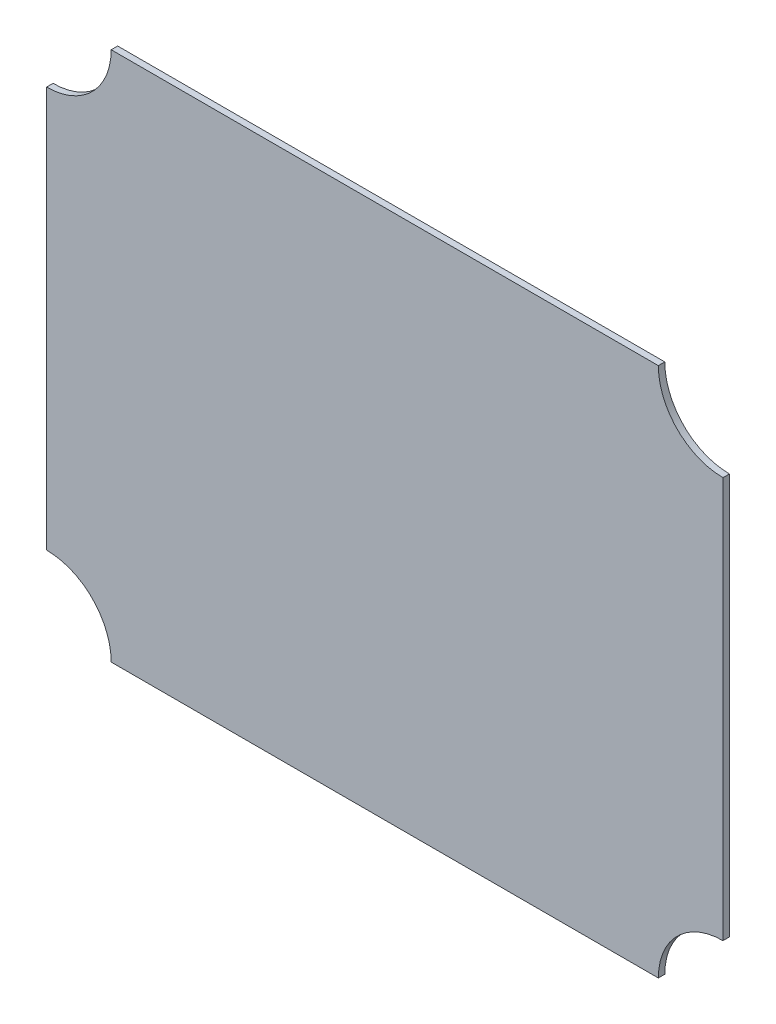
ISO-10303-21;
HEADER;
FILE_DESCRIPTION(('STEP AP214'),'2;1');
FILE_NAME('part.step','',(''),(''),'','','');
FILE_SCHEMA(('AUTOMOTIVE_DESIGN { 1 0 10303 214 1 1 1 1 }'));
ENDSEC;
DATA;
#1=APPLICATION_CONTEXT('core data for automotive mechanical design processes');
#2=APPLICATION_PROTOCOL_DEFINITION('international standard','automotive_design',2000,#1);
#3=PRODUCT_CONTEXT('',#1,'mechanical');
#4=PRODUCT('Part','Part','',(#3));
#5=PRODUCT_RELATED_PRODUCT_CATEGORY('part','',(#4));
#6=PRODUCT_DEFINITION_FORMATION('','',#4);
#7=PRODUCT_DEFINITION_CONTEXT('part definition',#1,'design');
#8=PRODUCT_DEFINITION('design','',#6,#7);
#9=PRODUCT_DEFINITION_SHAPE('','',#8);
#10=(LENGTH_UNIT() NAMED_UNIT(*) SI_UNIT(.MILLI.,.METRE.));
#11=(NAMED_UNIT(*) PLANE_ANGLE_UNIT() SI_UNIT($,.RADIAN.));
#12=(NAMED_UNIT(*) SI_UNIT($,.STERADIAN.) SOLID_ANGLE_UNIT());
#13=UNCERTAINTY_MEASURE_WITH_UNIT(LENGTH_MEASURE(1.E-05),#10,'distance_accuracy_value','');
#14=(GEOMETRIC_REPRESENTATION_CONTEXT(3) GLOBAL_UNCERTAINTY_ASSIGNED_CONTEXT((#13)) GLOBAL_UNIT_ASSIGNED_CONTEXT((#10,
#11,#12)) REPRESENTATION_CONTEXT('',''));
#15=CARTESIAN_POINT('',(0.,0.,0.));
#16=DIRECTION('',(0.,0.,1.));
#17=DIRECTION('',(1.,0.,0.));
#18=AXIS2_PLACEMENT_3D('',#15,#16,#17);
#19=CARTESIAN_POINT('',(261.5,205.,2.5));
#20=DIRECTION('',(0.,0.,-1.));
#21=DIRECTION('',(-1.,0.,0.));
#22=AXIS2_PLACEMENT_3D('',#19,#20,#21);
#23=CYLINDRICAL_SURFACE('',#22,50.);
#24=CARTESIAN_POINT('',(261.5,205.,-2.5));
#25=DIRECTION('',(0.,0.,-1.));
#26=DIRECTION('',(-1.,0.,0.));
#27=AXIS2_PLACEMENT_3D('',#24,#25,#26);
#28=CIRCLE('',#27,50.);
#29=CARTESIAN_POINT('',(261.5,155.,-2.5));
#30=VERTEX_POINT('',#29);
#31=CARTESIAN_POINT('',(211.5,205.,-2.5));
#32=VERTEX_POINT('',#31);
#33=EDGE_CURVE('E137',#30,#32,#28,.T.);
#34=ORIENTED_EDGE('',*,*,#33,.T.);
#35=DIRECTION('',(0.,0.,-1.));
#36=VECTOR('',#35,1.);
#37=CARTESIAN_POINT('',(211.5,205.,2.5));
#38=LINE('',#37,#36);
#39=CARTESIAN_POINT('',(211.5,205.,2.5));
#40=VERTEX_POINT('',#39);
#41=EDGE_CURVE('E12',#40,#32,#38,.T.);
#42=ORIENTED_EDGE('',*,*,#41,.F.);
#43=CARTESIAN_POINT('',(261.5,205.,2.5));
#44=DIRECTION('',(0.,0.,-1.));
#45=DIRECTION('',(-1.,0.,0.));
#46=AXIS2_PLACEMENT_3D('',#43,#44,#45);
#47=CIRCLE('',#46,50.);
#48=CARTESIAN_POINT('',(261.5,155.,2.5));
#49=VERTEX_POINT('',#48);
#50=EDGE_CURVE('E153',#49,#40,#47,.T.);
#51=ORIENTED_EDGE('',*,*,#50,.F.);
#52=DIRECTION('',(0.,0.,-1.));
#53=VECTOR('',#52,1.);
#54=CARTESIAN_POINT('',(261.5,155.,2.5));
#55=LINE('',#54,#53);
#56=EDGE_CURVE('E133',#49,#30,#55,.T.);
#57=ORIENTED_EDGE('',*,*,#56,.T.);
#58=EDGE_LOOP('',(#34,#42,#51,#57));
#59=FACE_BOUND('',#58,.T.);
#60=ADVANCED_FACE('F41',(#59),#23,.F.);
#61=CARTESIAN_POINT('',(-211.5,205.,2.5));
#62=DIRECTION('',(0.,-1.,0.));
#63=DIRECTION('',(1.,0.,0.));
#64=AXIS2_PLACEMENT_3D('',#61,#62,#63);
#65=PLANE('',#64);
#66=DIRECTION('',(-1.,0.,0.));
#67=VECTOR('',#66,1.);
#68=CARTESIAN_POINT('',(-211.5,205.,-2.5));
#69=LINE('',#68,#67);
#70=CARTESIAN_POINT('',(-211.5,205.,-2.5));
#71=VERTEX_POINT('',#70);
#72=EDGE_CURVE('E141',#32,#71,#69,.T.);
#73=ORIENTED_EDGE('',*,*,#72,.T.);
#74=DIRECTION('',(0.,0.,-1.));
#75=VECTOR('',#74,1.);
#76=CARTESIAN_POINT('',(-211.5,205.,2.5));
#77=LINE('',#76,#75);
#78=CARTESIAN_POINT('',(-211.5,205.,2.5));
#79=VERTEX_POINT('',#78);
#80=EDGE_CURVE('E49',#79,#71,#77,.T.);
#81=ORIENTED_EDGE('',*,*,#80,.F.);
#82=DIRECTION('',(-1.,0.,0.));
#83=VECTOR('',#82,1.);
#84=CARTESIAN_POINT('',(-211.5,205.,2.5));
#85=LINE('',#84,#83);
#86=EDGE_CURVE('E100',#40,#79,#85,.T.);
#87=ORIENTED_EDGE('',*,*,#86,.F.);
#88=ORIENTED_EDGE('',*,*,#41,.T.);
#89=EDGE_LOOP('',(#73,#81,#87,#88));
#90=FACE_BOUND('',#89,.T.);
#91=ADVANCED_FACE('F210',(#90),#65,.F.);
#92=CARTESIAN_POINT('',(-261.5,205.,2.5));
#93=DIRECTION('',(0.,0.,-1.));
#94=DIRECTION('',(-1.,0.,0.));
#95=AXIS2_PLACEMENT_3D('',#92,#93,#94);
#96=CYLINDRICAL_SURFACE('',#95,50.);
#97=CARTESIAN_POINT('',(-261.5,205.,-2.5));
#98=DIRECTION('',(0.,0.,-1.));
#99=DIRECTION('',(1.,0.,0.));
#100=AXIS2_PLACEMENT_3D('',#97,#98,#99);
#101=CIRCLE('',#100,50.);
#102=CARTESIAN_POINT('',(-261.5,155.,-2.5));
#103=VERTEX_POINT('',#102);
#104=EDGE_CURVE('E170',#71,#103,#101,.T.);
#105=ORIENTED_EDGE('',*,*,#104,.T.);
#106=DIRECTION('',(0.,0.,-1.));
#107=VECTOR('',#106,1.);
#108=CARTESIAN_POINT('',(-261.5,155.,2.5));
#109=LINE('',#108,#107);
#110=CARTESIAN_POINT('',(-261.5,155.,2.5));
#111=VERTEX_POINT('',#110);
#112=EDGE_CURVE('E162',#111,#103,#109,.T.);
#113=ORIENTED_EDGE('',*,*,#112,.F.);
#114=CARTESIAN_POINT('',(-261.5,205.,2.5));
#115=DIRECTION('',(0.,0.,-1.));
#116=DIRECTION('',(1.,0.,0.));
#117=AXIS2_PLACEMENT_3D('',#114,#115,#116);
#118=CIRCLE('',#117,50.);
#119=EDGE_CURVE('E171',#79,#111,#118,.T.);
#120=ORIENTED_EDGE('',*,*,#119,.F.);
#121=ORIENTED_EDGE('',*,*,#80,.T.);
#122=EDGE_LOOP('',(#105,#113,#120,#121));
#123=FACE_BOUND('',#122,.T.);
#124=ADVANCED_FACE('F168',(#123),#96,.F.);
#125=CARTESIAN_POINT('',(-261.5,155.,2.5));
#126=DIRECTION('',(1.,0.,0.));
#127=DIRECTION('',(0.,1.,0.));
#128=AXIS2_PLACEMENT_3D('',#125,#126,#127);
#129=PLANE('',#128);
#130=DIRECTION('',(0.,-1.,0.));
#131=VECTOR('',#130,1.);
#132=CARTESIAN_POINT('',(-261.5,155.,-2.5));
#133=LINE('',#132,#131);
#134=CARTESIAN_POINT('',(-261.5,-155.,-2.5));
#135=VERTEX_POINT('',#134);
#136=EDGE_CURVE('E177',#103,#135,#133,.T.);
#137=ORIENTED_EDGE('',*,*,#136,.T.);
#138=DIRECTION('',(0.,0.,-1.));
#139=VECTOR('',#138,1.);
#140=CARTESIAN_POINT('',(-261.5,-155.,2.5));
#141=LINE('',#140,#139);
#142=CARTESIAN_POINT('',(-261.5,-155.,2.5));
#143=VERTEX_POINT('',#142);
#144=EDGE_CURVE('E159',#143,#135,#141,.T.);
#145=ORIENTED_EDGE('',*,*,#144,.F.);
#146=DIRECTION('',(0.,-1.,0.));
#147=VECTOR('',#146,1.);
#148=CARTESIAN_POINT('',(-261.5,155.,2.5));
#149=LINE('',#148,#147);
#150=EDGE_CURVE('E302',#111,#143,#149,.T.);
#151=ORIENTED_EDGE('',*,*,#150,.F.);
#152=ORIENTED_EDGE('',*,*,#112,.T.);
#153=EDGE_LOOP('',(#137,#145,#151,#152));
#154=FACE_BOUND('',#153,.T.);
#155=ADVANCED_FACE('F217',(#154),#129,.F.);
#156=CARTESIAN_POINT('',(-261.5,-205.,2.5));
#157=DIRECTION('',(0.,0.,-1.));
#158=DIRECTION('',(-1.,0.,0.));
#159=AXIS2_PLACEMENT_3D('',#156,#157,#158);
#160=CYLINDRICAL_SURFACE('',#159,50.);
#161=CARTESIAN_POINT('',(-261.5,-205.,-2.5));
#162=DIRECTION('',(0.,0.,-1.));
#163=DIRECTION('',(-1.,0.,0.));
#164=AXIS2_PLACEMENT_3D('',#161,#162,#163);
#165=CIRCLE('',#164,50.);
#166=CARTESIAN_POINT('',(-211.5,-205.,-2.5));
#167=VERTEX_POINT('',#166);
#168=EDGE_CURVE('E181',#135,#167,#165,.T.);
#169=ORIENTED_EDGE('',*,*,#168,.T.);
#170=DIRECTION('',(0.,0.,-1.));
#171=VECTOR('',#170,1.);
#172=CARTESIAN_POINT('',(-211.5,-205.,2.5));
#173=LINE('',#172,#171);
#174=CARTESIAN_POINT('',(-211.5,-205.,2.5));
#175=VERTEX_POINT('',#174);
#176=EDGE_CURVE('E128',#175,#167,#173,.T.);
#177=ORIENTED_EDGE('',*,*,#176,.F.);
#178=CARTESIAN_POINT('',(-261.5,-205.,2.5));
#179=DIRECTION('',(0.,0.,-1.));
#180=DIRECTION('',(-1.,0.,0.));
#181=AXIS2_PLACEMENT_3D('',#178,#179,#180);
#182=CIRCLE('',#181,50.);
#183=EDGE_CURVE('E119',#143,#175,#182,.T.);
#184=ORIENTED_EDGE('',*,*,#183,.F.);
#185=ORIENTED_EDGE('',*,*,#144,.T.);
#186=EDGE_LOOP('',(#169,#177,#184,#185));
#187=FACE_BOUND('',#186,.T.);
#188=ADVANCED_FACE('F194',(#187),#160,.F.);
#189=CARTESIAN_POINT('',(-211.5,-205.,2.5));
#190=DIRECTION('',(0.,1.,0.));
#191=DIRECTION('',(-1.,0.,0.));
#192=AXIS2_PLACEMENT_3D('',#189,#190,#191);
#193=PLANE('',#192);
#194=DIRECTION('',(1.,0.,0.));
#195=VECTOR('',#194,1.);
#196=CARTESIAN_POINT('',(-211.5,-205.,-2.5));
#197=LINE('',#196,#195);
#198=CARTESIAN_POINT('',(211.5,-205.,-2.5));
#199=VERTEX_POINT('',#198);
#200=EDGE_CURVE('E127',#167,#199,#197,.T.);
#201=ORIENTED_EDGE('',*,*,#200,.T.);
#202=DIRECTION('',(0.,0.,-1.));
#203=VECTOR('',#202,1.);
#204=CARTESIAN_POINT('',(211.5,-205.,2.5));
#205=LINE('',#204,#203);
#206=CARTESIAN_POINT('',(211.5,-205.,2.5));
#207=VERTEX_POINT('',#206);
#208=EDGE_CURVE('E124',#207,#199,#205,.T.);
#209=ORIENTED_EDGE('',*,*,#208,.F.);
#210=DIRECTION('',(1.,0.,0.));
#211=VECTOR('',#210,1.);
#212=CARTESIAN_POINT('',(-211.5,-205.,2.5));
#213=LINE('',#212,#211);
#214=EDGE_CURVE('E113',#175,#207,#213,.T.);
#215=ORIENTED_EDGE('',*,*,#214,.F.);
#216=ORIENTED_EDGE('',*,*,#176,.T.);
#217=EDGE_LOOP('',(#201,#209,#215,#216));
#218=FACE_BOUND('',#217,.T.);
#219=ADVANCED_FACE('F125',(#218),#193,.F.);
#220=CARTESIAN_POINT('',(261.5,-205.,2.5));
#221=DIRECTION('',(0.,0.,-1.));
#222=DIRECTION('',(-1.,0.,0.));
#223=AXIS2_PLACEMENT_3D('',#220,#221,#222);
#224=CYLINDRICAL_SURFACE('',#223,50.);
#225=CARTESIAN_POINT('',(261.5,-205.,-2.5));
#226=DIRECTION('',(0.,0.,-1.));
#227=DIRECTION('',(1.,0.,0.));
#228=AXIS2_PLACEMENT_3D('',#225,#226,#227);
#229=CIRCLE('',#228,50.);
#230=CARTESIAN_POINT('',(261.5,-155.,-2.5));
#231=VERTEX_POINT('',#230);
#232=EDGE_CURVE('E86',#199,#231,#229,.T.);
#233=ORIENTED_EDGE('',*,*,#232,.T.);
#234=DIRECTION('',(0.,0.,-1.));
#235=VECTOR('',#234,1.);
#236=CARTESIAN_POINT('',(261.5,-155.,2.5));
#237=LINE('',#236,#235);
#238=CARTESIAN_POINT('',(261.5,-155.,2.5));
#239=VERTEX_POINT('',#238);
#240=EDGE_CURVE('E129',#239,#231,#237,.T.);
#241=ORIENTED_EDGE('',*,*,#240,.F.);
#242=CARTESIAN_POINT('',(261.5,-205.,2.5));
#243=DIRECTION('',(0.,0.,-1.));
#244=DIRECTION('',(1.,0.,0.));
#245=AXIS2_PLACEMENT_3D('',#242,#243,#244);
#246=CIRCLE('',#245,50.);
#247=EDGE_CURVE('E117',#207,#239,#246,.T.);
#248=ORIENTED_EDGE('',*,*,#247,.F.);
#249=ORIENTED_EDGE('',*,*,#208,.T.);
#250=EDGE_LOOP('',(#233,#241,#248,#249));
#251=FACE_BOUND('',#250,.T.);
#252=ADVANCED_FACE('F131',(#251),#224,.F.);
#253=CARTESIAN_POINT('',(261.5,155.,2.5));
#254=DIRECTION('',(-1.,0.,0.));
#255=DIRECTION('',(0.,0.,1.));
#256=AXIS2_PLACEMENT_3D('',#253,#254,#255);
#257=PLANE('',#256);
#258=DIRECTION('',(0.,1.,0.));
#259=VECTOR('',#258,1.);
#260=CARTESIAN_POINT('',(261.5,155.,-2.5));
#261=LINE('',#260,#259);
#262=EDGE_CURVE('E92',#231,#30,#261,.T.);
#263=ORIENTED_EDGE('',*,*,#262,.T.);
#264=ORIENTED_EDGE('',*,*,#56,.F.);
#265=DIRECTION('',(0.,1.,0.));
#266=VECTOR('',#265,1.);
#267=CARTESIAN_POINT('',(261.5,155.,2.5));
#268=LINE('',#267,#266);
#269=EDGE_CURVE('E57',#239,#49,#268,.T.);
#270=ORIENTED_EDGE('',*,*,#269,.F.);
#271=ORIENTED_EDGE('',*,*,#240,.T.);
#272=EDGE_LOOP('',(#263,#264,#270,#271));
#273=FACE_BOUND('',#272,.T.);
#274=ADVANCED_FACE('F199',(#273),#257,.F.);
#275=CARTESIAN_POINT('',(261.5,205.,2.5));
#276=DIRECTION('',(0.,0.,-1.));
#277=DIRECTION('',(-1.,0.,0.));
#278=AXIS2_PLACEMENT_3D('',#275,#276,#277);
#279=PLANE('',#278);
#280=ORIENTED_EDGE('',*,*,#50,.T.);
#281=ORIENTED_EDGE('',*,*,#86,.T.);
#282=ORIENTED_EDGE('',*,*,#119,.T.);
#283=ORIENTED_EDGE('',*,*,#150,.T.);
#284=ORIENTED_EDGE('',*,*,#183,.T.);
#285=ORIENTED_EDGE('',*,*,#214,.T.);
#286=ORIENTED_EDGE('',*,*,#247,.T.);
#287=ORIENTED_EDGE('',*,*,#269,.T.);
#288=EDGE_LOOP('',(#280,#281,#282,#283,#284,#285,#286,#287));
#289=FACE_BOUND('',#288,.T.);
#290=ADVANCED_FACE('F115',(#289),#279,.F.);
#291=CARTESIAN_POINT('',(261.5,205.,-2.5));
#292=DIRECTION('',(0.,0.,-1.));
#293=DIRECTION('',(-1.,0.,0.));
#294=AXIS2_PLACEMENT_3D('',#291,#292,#293);
#295=PLANE('',#294);
#296=ORIENTED_EDGE('',*,*,#33,.F.);
#297=ORIENTED_EDGE('',*,*,#262,.F.);
#298=ORIENTED_EDGE('',*,*,#232,.F.);
#299=ORIENTED_EDGE('',*,*,#200,.F.);
#300=ORIENTED_EDGE('',*,*,#168,.F.);
#301=ORIENTED_EDGE('',*,*,#136,.F.);
#302=ORIENTED_EDGE('',*,*,#104,.F.);
#303=ORIENTED_EDGE('',*,*,#72,.F.);
#304=EDGE_LOOP('',(#296,#297,#298,#299,#300,#301,#302,#303));
#305=FACE_BOUND('',#304,.T.);
#306=ADVANCED_FACE('F175',(#305),#295,.T.);
#307=CLOSED_SHELL('',(#60,#91,#124,#155,#188,#219,#252,#274,#290,#306));
#308=MANIFOLD_SOLID_BREP('B2',#307);
#309=ADVANCED_BREP_SHAPE_REPRESENTATION('',(#18,#308),#14);
#310=SHAPE_DEFINITION_REPRESENTATION(#9,#309);
ENDSEC;
END-ISO-10303-21;
